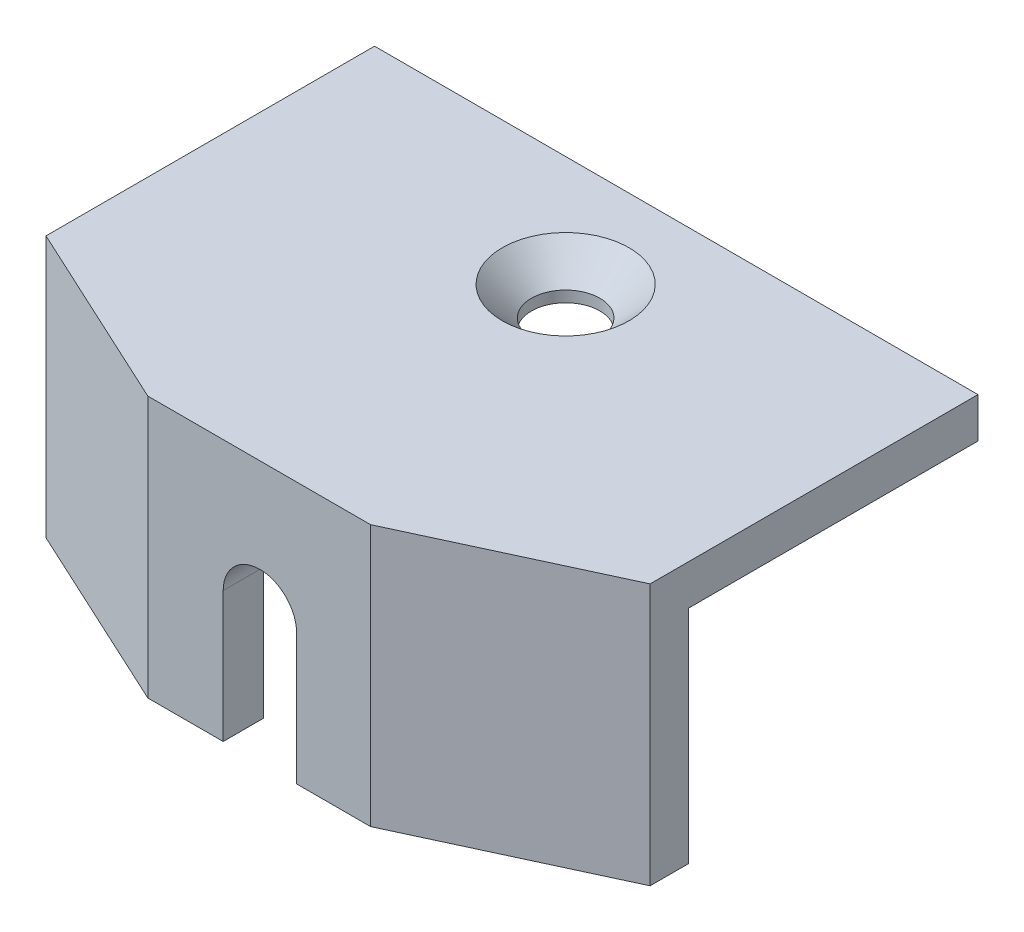
ISO-10303-21;
HEADER;
FILE_DESCRIPTION(('STEP AP214'),'2;1');
FILE_NAME('part.step','',(''),(''),'','','');
FILE_SCHEMA(('AUTOMOTIVE_DESIGN { 1 0 10303 214 1 1 1 1 }'));
ENDSEC;
DATA;
#1=APPLICATION_CONTEXT('core data for automotive mechanical design processes');
#2=APPLICATION_PROTOCOL_DEFINITION('international standard','automotive_design',2000,#1);
#3=PRODUCT_CONTEXT('',#1,'mechanical');
#4=PRODUCT('Part','Part','',(#3));
#5=PRODUCT_RELATED_PRODUCT_CATEGORY('part','',(#4));
#6=PRODUCT_DEFINITION_FORMATION('','',#4);
#7=PRODUCT_DEFINITION_CONTEXT('part definition',#1,'design');
#8=PRODUCT_DEFINITION('design','',#6,#7);
#9=PRODUCT_DEFINITION_SHAPE('','',#8);
#10=(LENGTH_UNIT() NAMED_UNIT(*) SI_UNIT(.MILLI.,.METRE.));
#11=(NAMED_UNIT(*) PLANE_ANGLE_UNIT() SI_UNIT($,.RADIAN.));
#12=(NAMED_UNIT(*) SI_UNIT($,.STERADIAN.) SOLID_ANGLE_UNIT());
#13=UNCERTAINTY_MEASURE_WITH_UNIT(LENGTH_MEASURE(1.E-05),#10,'distance_accuracy_value','');
#14=(GEOMETRIC_REPRESENTATION_CONTEXT(3) GLOBAL_UNCERTAINTY_ASSIGNED_CONTEXT((#13)) GLOBAL_UNIT_ASSIGNED_CONTEXT((#10,
#11,#12)) REPRESENTATION_CONTEXT('',''));
#15=CARTESIAN_POINT('',(0.,0.,0.));
#16=DIRECTION('',(0.,0.,1.));
#17=DIRECTION('',(1.,0.,0.));
#18=AXIS2_PLACEMENT_3D('',#15,#16,#17);
#19=CARTESIAN_POINT('',(0.,-11.,0.));
#20=DIRECTION('',(0.,1.,0.));
#21=DIRECTION('',(0.,0.,1.));
#22=AXIS2_PLACEMENT_3D('',#19,#20,#21);
#23=PLANE('',#22);
#24=DIRECTION('',(1.,0.,0.));
#25=VECTOR('',#24,1.);
#26=CARTESIAN_POINT('',(-5.57275566181239,-11.,20.700000004282));
#27=LINE('',#26,#25);
#28=CARTESIAN_POINT('',(1.825,-11.,20.700000004282));
#29=VERTEX_POINT('',#28);
#30=CARTESIAN_POINT('',(5.5,-11.,20.700000004282));
#31=VERTEX_POINT('',#30);
#32=EDGE_CURVE('E173',#29,#31,#27,.T.);
#33=ORIENTED_EDGE('',*,*,#32,.F.);
#34=DIRECTION('',(0.,0.,1.));
#35=VECTOR('',#34,1.);
#36=CARTESIAN_POINT('',(1.825,-11.,13.700000004282));
#37=LINE('',#36,#35);
#38=CARTESIAN_POINT('',(1.825,-11.,18.700000004282));
#39=VERTEX_POINT('',#38);
#40=EDGE_CURVE('E11',#29,#39,#37,.F.);
#41=ORIENTED_EDGE('',*,*,#40,.T.);
#42=DIRECTION('',(-1.,0.,0.));
#43=VECTOR('',#42,1.);
#44=CARTESIAN_POINT('',(5.71590909,-11.,18.700000004282));
#45=LINE('',#44,#43);
#46=CARTESIAN_POINT('',(5.71590909,-11.,18.700000004282));
#47=VERTEX_POINT('',#46);
#48=EDGE_CURVE('E118',#47,#39,#45,.T.);
#49=ORIENTED_EDGE('',*,*,#48,.F.);
#50=DIRECTION('',(-0.907399459721824,0.,0.420269223827466));
#51=VECTOR('',#50,1.);
#52=CARTESIAN_POINT('',(15.,-11.,14.4));
#53=LINE('',#52,#51);
#54=CARTESIAN_POINT('',(15.,-11.,14.4));
#55=VERTEX_POINT('',#54);
#56=EDGE_CURVE('E185',#55,#47,#53,.T.);
#57=ORIENTED_EDGE('',*,*,#56,.F.);
#58=DIRECTION('',(0.,0.,-1.));
#59=VECTOR('',#58,1.);
#60=CARTESIAN_POINT('',(15.,-11.,16.3000000003313));
#61=LINE('',#60,#59);
#62=CARTESIAN_POINT('',(15.,-11.,16.3000000003313));
#63=VERTEX_POINT('',#62);
#64=EDGE_CURVE('E176',#63,#55,#61,.T.);
#65=ORIENTED_EDGE('',*,*,#64,.F.);
#66=DIRECTION('',(0.907399459721825,0.,-0.420269223827466));
#67=VECTOR('',#66,1.);
#68=CARTESIAN_POINT('',(5.5,-11.,20.700000004282));
#69=LINE('',#68,#67);
#70=EDGE_CURVE('E172',#31,#63,#69,.T.);
#71=ORIENTED_EDGE('',*,*,#70,.F.);
#72=EDGE_LOOP('',(#33,#41,#49,#57,#65,#71));
#73=FACE_BOUND('',#72,.T.);
#74=ADVANCED_FACE('F41',(#73),#23,.F.);
#75=CARTESIAN_POINT('',(15.,2.,14.4));
#76=DIRECTION('',(-1.,0.,0.));
#77=DIRECTION('',(0.,0.,1.));
#78=AXIS2_PLACEMENT_3D('',#75,#76,#77);
#79=PLANE('',#78);
#80=DIRECTION('',(0.,0.,-1.));
#81=VECTOR('',#80,1.);
#82=CARTESIAN_POINT('',(15.,0.,14.4));
#83=LINE('',#82,#81);
#84=CARTESIAN_POINT('',(15.,0.,14.4));
#85=VERTEX_POINT('',#84);
#86=CARTESIAN_POINT('',(15.,0.,0.));
#87=VERTEX_POINT('',#86);
#88=EDGE_CURVE('E145',#85,#87,#83,.T.);
#89=ORIENTED_EDGE('',*,*,#88,.T.);
#90=DIRECTION('',(0.,-1.,0.));
#91=VECTOR('',#90,1.);
#92=CARTESIAN_POINT('',(15.,2.,0.));
#93=LINE('',#92,#91);
#94=CARTESIAN_POINT('',(15.,2.,0.));
#95=VERTEX_POINT('',#94);
#96=EDGE_CURVE('E149',#95,#87,#93,.T.);
#97=ORIENTED_EDGE('',*,*,#96,.F.);
#98=DIRECTION('',(0.,0.,-1.));
#99=VECTOR('',#98,1.);
#100=CARTESIAN_POINT('',(15.,2.,14.4));
#101=LINE('',#100,#99);
#102=CARTESIAN_POINT('',(15.,2.,16.3000000003313));
#103=VERTEX_POINT('',#102);
#104=EDGE_CURVE('E100',#103,#95,#101,.T.);
#105=ORIENTED_EDGE('',*,*,#104,.F.);
#106=DIRECTION('',(0.,1.,0.));
#107=VECTOR('',#106,1.);
#108=CARTESIAN_POINT('',(15.,-11.,16.3000000003313));
#109=LINE('',#108,#107);
#110=EDGE_CURVE('E205',#63,#103,#109,.T.);
#111=ORIENTED_EDGE('',*,*,#110,.F.);
#112=ORIENTED_EDGE('',*,*,#64,.T.);
#113=DIRECTION('',(0.,1.,0.));
#114=VECTOR('',#113,1.);
#115=CARTESIAN_POINT('',(15.,-11.,14.4));
#116=LINE('',#115,#114);
#117=EDGE_CURVE('E202',#55,#85,#116,.T.);
#118=ORIENTED_EDGE('',*,*,#117,.T.);
#119=EDGE_LOOP('',(#89,#97,#105,#111,#112,#118));
#120=FACE_BOUND('',#119,.T.);
#121=ADVANCED_FACE('F43',(#120),#79,.F.);
#122=CARTESIAN_POINT('',(-15.,2.,0.));
#123=DIRECTION('',(0.,0.,1.));
#124=DIRECTION('',(1.,0.,0.));
#125=AXIS2_PLACEMENT_3D('',#122,#123,#124);
#126=PLANE('',#125);
#127=DIRECTION('',(-1.,0.,0.));
#128=VECTOR('',#127,1.);
#129=CARTESIAN_POINT('',(-15.,0.,0.));
#130=LINE('',#129,#128);
#131=CARTESIAN_POINT('',(-15.,0.,0.));
#132=VERTEX_POINT('',#131);
#133=EDGE_CURVE('E101',#87,#132,#130,.T.);
#134=ORIENTED_EDGE('',*,*,#133,.T.);
#135=DIRECTION('',(0.,-1.,0.));
#136=VECTOR('',#135,1.);
#137=CARTESIAN_POINT('',(-15.,2.,0.));
#138=LINE('',#137,#136);
#139=CARTESIAN_POINT('',(-15.,2.,0.));
#140=VERTEX_POINT('',#139);
#141=EDGE_CURVE('E97',#140,#132,#138,.T.);
#142=ORIENTED_EDGE('',*,*,#141,.F.);
#143=DIRECTION('',(-1.,0.,0.));
#144=VECTOR('',#143,1.);
#145=CARTESIAN_POINT('',(-15.,2.,0.));
#146=LINE('',#145,#144);
#147=EDGE_CURVE('E65',#95,#140,#146,.T.);
#148=ORIENTED_EDGE('',*,*,#147,.F.);
#149=ORIENTED_EDGE('',*,*,#96,.T.);
#150=EDGE_LOOP('',(#134,#142,#148,#149));
#151=FACE_BOUND('',#150,.T.);
#152=ADVANCED_FACE('F296',(#151),#126,.F.);
#153=CARTESIAN_POINT('',(-15.,2.,14.4));
#154=DIRECTION('',(1.,0.,0.));
#155=DIRECTION('',(0.,0.,-1.));
#156=AXIS2_PLACEMENT_3D('',#153,#154,#155);
#157=PLANE('',#156);
#158=DIRECTION('',(0.,0.,1.));
#159=VECTOR('',#158,1.);
#160=CARTESIAN_POINT('',(-15.,0.,14.4));
#161=LINE('',#160,#159);
#162=CARTESIAN_POINT('',(-15.,0.,14.4));
#163=VERTEX_POINT('',#162);
#164=EDGE_CURVE('E88',#132,#163,#161,.T.);
#165=ORIENTED_EDGE('',*,*,#164,.T.);
#166=DIRECTION('',(0.,1.,0.));
#167=VECTOR('',#166,1.);
#168=CARTESIAN_POINT('',(-15.,-11.,14.4));
#169=LINE('',#168,#167);
#170=CARTESIAN_POINT('',(-15.,-11.,14.4));
#171=VERTEX_POINT('',#170);
#172=EDGE_CURVE('E94',#171,#163,#169,.T.);
#173=ORIENTED_EDGE('',*,*,#172,.F.);
#174=DIRECTION('',(0.,0.,1.));
#175=VECTOR('',#174,1.);
#176=CARTESIAN_POINT('',(-15.,-11.,14.4));
#177=LINE('',#176,#175);
#178=CARTESIAN_POINT('',(-15.,-11.,16.3336973595167));
#179=VERTEX_POINT('',#178);
#180=EDGE_CURVE('E224',#171,#179,#177,.T.);
#181=ORIENTED_EDGE('',*,*,#180,.T.);
#182=DIRECTION('',(0.,1.,0.));
#183=VECTOR('',#182,1.);
#184=CARTESIAN_POINT('',(-15.,-11.,16.3336973595167));
#185=LINE('',#184,#183);
#186=CARTESIAN_POINT('',(-15.,2.,16.3336973595167));
#187=VERTEX_POINT('',#186);
#188=EDGE_CURVE('E117',#179,#187,#185,.T.);
#189=ORIENTED_EDGE('',*,*,#188,.T.);
#190=DIRECTION('',(0.,0.,1.));
#191=VECTOR('',#190,1.);
#192=CARTESIAN_POINT('',(-15.,2.,14.4));
#193=LINE('',#192,#191);
#194=EDGE_CURVE('E139',#140,#187,#193,.T.);
#195=ORIENTED_EDGE('',*,*,#194,.F.);
#196=ORIENTED_EDGE('',*,*,#141,.T.);
#197=EDGE_LOOP('',(#165,#173,#181,#189,#195,#196));
#198=FACE_BOUND('',#197,.T.);
#199=ADVANCED_FACE('F90',(#198),#157,.F.);
#200=CARTESIAN_POINT('',(0.,2.,0.));
#201=DIRECTION('',(0.,1.,0.));
#202=DIRECTION('',(0.,0.,1.));
#203=AXIS2_PLACEMENT_3D('',#200,#201,#202);
#204=PLANE('',#203);
#205=CARTESIAN_POINT('',(0.,2.,5.5));
#206=DIRECTION('',(0.,1.,0.));
#207=DIRECTION('',(0.,0.,1.));
#208=AXIS2_PLACEMENT_3D('',#205,#206,#207);
#209=CIRCLE('',#208,3.15);
#210=CARTESIAN_POINT('',(0.,2.,8.65));
#211=VERTEX_POINT('',#210);
#212=EDGE_CURVE('E128',#211,#211,#209,.T.);
#213=ORIENTED_EDGE('',*,*,#212,.F.);
#214=EDGE_LOOP('',(#213));
#215=FACE_BOUND('',#214,.T.);
#216=ORIENTED_EDGE('',*,*,#194,.T.);
#217=DIRECTION('',(0.907399459721825,0.,0.420269223827466));
#218=VECTOR('',#217,1.);
#219=CARTESIAN_POINT('',(-15.,2.,16.3336973595167));
#220=LINE('',#219,#218);
#221=CARTESIAN_POINT('',(-5.57275566181239,2.,20.700000004282));
#222=VERTEX_POINT('',#221);
#223=EDGE_CURVE('E188',#187,#222,#220,.T.);
#224=ORIENTED_EDGE('',*,*,#223,.T.);
#225=DIRECTION('',(1.,0.,0.));
#226=VECTOR('',#225,1.);
#227=CARTESIAN_POINT('',(-5.57275566181239,2.,20.700000004282));
#228=LINE('',#227,#226);
#229=CARTESIAN_POINT('',(5.5,2.,20.700000004282));
#230=VERTEX_POINT('',#229);
#231=EDGE_CURVE('E191',#222,#230,#228,.T.);
#232=ORIENTED_EDGE('',*,*,#231,.T.);
#233=DIRECTION('',(0.907399459721825,0.,-0.420269223827466));
#234=VECTOR('',#233,1.);
#235=CARTESIAN_POINT('',(5.5,2.,20.700000004282));
#236=LINE('',#235,#234);
#237=EDGE_CURVE('E195',#230,#103,#236,.T.);
#238=ORIENTED_EDGE('',*,*,#237,.T.);
#239=ORIENTED_EDGE('',*,*,#104,.T.);
#240=ORIENTED_EDGE('',*,*,#147,.T.);
#241=EDGE_LOOP('',(#216,#224,#232,#238,#239,#240));
#242=FACE_BOUND('',#241,.T.);
#243=ADVANCED_FACE('F220',(#215,#242),#204,.T.);
#244=CARTESIAN_POINT('',(0.,0.,0.));
#245=DIRECTION('',(0.,1.,0.));
#246=DIRECTION('',(0.,0.,1.));
#247=AXIS2_PLACEMENT_3D('',#244,#245,#246);
#248=PLANE('',#247);
#249=CARTESIAN_POINT('',(0.,0.,5.5));
#250=DIRECTION('',(0.,1.,0.));
#251=DIRECTION('',(0.,0.,1.));
#252=AXIS2_PLACEMENT_3D('',#249,#250,#251);
#253=CIRCLE('',#252,1.7);
#254=CARTESIAN_POINT('',(0.,0.,7.2));
#255=VERTEX_POINT('',#254);
#256=EDGE_CURVE('E111',#255,#255,#253,.T.);
#257=ORIENTED_EDGE('',*,*,#256,.T.);
#258=EDGE_LOOP('',(#257));
#259=FACE_BOUND('',#258,.T.);
#260=DIRECTION('',(0.907399459721824,0.,0.420269223827466));
#261=VECTOR('',#260,1.);
#262=CARTESIAN_POINT('',(-15.,0.,14.4));
#263=LINE('',#262,#261);
#264=CARTESIAN_POINT('',(-5.71590909,0.,18.700000004282));
#265=VERTEX_POINT('',#264);
#266=EDGE_CURVE('E104',#163,#265,#263,.T.);
#267=ORIENTED_EDGE('',*,*,#266,.F.);
#268=ORIENTED_EDGE('',*,*,#164,.F.);
#269=ORIENTED_EDGE('',*,*,#133,.F.);
#270=ORIENTED_EDGE('',*,*,#88,.F.);
#271=DIRECTION('',(0.907399459721824,0.,-0.420269223827466));
#272=VECTOR('',#271,1.);
#273=CARTESIAN_POINT('',(15.,0.,14.4));
#274=LINE('',#273,#272);
#275=CARTESIAN_POINT('',(5.71590909,0.,18.700000004282));
#276=VERTEX_POINT('',#275);
#277=EDGE_CURVE('E142',#276,#85,#274,.T.);
#278=ORIENTED_EDGE('',*,*,#277,.F.);
#279=DIRECTION('',(1.,0.,0.));
#280=VECTOR('',#279,1.);
#281=CARTESIAN_POINT('',(-5.71590909,0.,18.700000004282));
#282=LINE('',#281,#280);
#283=EDGE_CURVE('E107',#265,#276,#282,.T.);
#284=ORIENTED_EDGE('',*,*,#283,.F.);
#285=EDGE_LOOP('',(#267,#268,#269,#270,#278,#284));
#286=FACE_BOUND('',#285,.T.);
#287=ADVANCED_FACE('F105',(#259,#286),#248,.F.);
#288=CARTESIAN_POINT('',(0.,2.,5.5));
#289=DIRECTION('',(0.,1.,0.));
#290=DIRECTION('',(0.,0.,1.));
#291=AXIS2_PLACEMENT_3D('',#288,#289,#290);
#292=CYLINDRICAL_SURFACE('',#291,1.69999999999999);
#293=ORIENTED_EDGE('',*,*,#256,.F.);
#294=EDGE_LOOP('',(#293));
#295=FACE_BOUND('',#294,.T.);
#296=CARTESIAN_POINT('',(0.,0.549999999999993,5.5));
#297=DIRECTION('',(0.,1.,0.));
#298=DIRECTION('',(0.,0.,1.));
#299=AXIS2_PLACEMENT_3D('',#296,#297,#298);
#300=CIRCLE('',#299,1.69999999999999);
#301=CARTESIAN_POINT('',(0.,0.549999999999993,7.19999999999999));
#302=VERTEX_POINT('',#301);
#303=EDGE_CURVE('E131',#302,#302,#300,.T.);
#304=ORIENTED_EDGE('',*,*,#303,.T.);
#305=EDGE_LOOP('',(#304));
#306=FACE_BOUND('',#305,.T.);
#307=ADVANCED_FACE('F331',(#295,#306),#292,.F.);
#308=CARTESIAN_POINT('',(0.,2.,5.5));
#309=DIRECTION('',(0.,1.,0.));
#310=DIRECTION('',(0.,0.,1.));
#311=AXIS2_PLACEMENT_3D('',#308,#309,#310);
#312=CONICAL_SURFACE('',#311,3.15,0.78539816339745);
#313=ORIENTED_EDGE('',*,*,#303,.F.);
#314=EDGE_LOOP('',(#313));
#315=FACE_BOUND('',#314,.T.);
#316=ORIENTED_EDGE('',*,*,#212,.T.);
#317=EDGE_LOOP('',(#316));
#318=FACE_BOUND('',#317,.T.);
#319=ADVANCED_FACE('F328',(#315,#318),#312,.F.);
#320=CARTESIAN_POINT('',(-5.71590909,-11.,18.700000004282));
#321=DIRECTION('',(0.420269223827466,0.,-0.907399459721825));
#322=DIRECTION('',(-0.907399459721825,0.,-0.420269223827466));
#323=AXIS2_PLACEMENT_3D('',#320,#321,#322);
#324=PLANE('',#323);
#325=ORIENTED_EDGE('',*,*,#266,.T.);
#326=DIRECTION('',(0.,1.,0.));
#327=VECTOR('',#326,1.);
#328=CARTESIAN_POINT('',(-5.71590909,-11.,18.700000004282));
#329=LINE('',#328,#327);
#330=CARTESIAN_POINT('',(-5.71590909,-11.,18.700000004282));
#331=VERTEX_POINT('',#330);
#332=EDGE_CURVE('E132',#331,#265,#329,.T.);
#333=ORIENTED_EDGE('',*,*,#332,.F.);
#334=DIRECTION('',(-0.907399459721824,0.,-0.420269223827466));
#335=VECTOR('',#334,1.);
#336=CARTESIAN_POINT('',(-5.71590909,-11.,18.700000004282));
#337=LINE('',#336,#335);
#338=EDGE_CURVE('E116',#331,#171,#337,.T.);
#339=ORIENTED_EDGE('',*,*,#338,.T.);
#340=ORIENTED_EDGE('',*,*,#172,.T.);
#341=EDGE_LOOP('',(#325,#333,#339,#340));
#342=FACE_BOUND('',#341,.T.);
#343=ADVANCED_FACE('F114',(#342),#324,.T.);
#344=CARTESIAN_POINT('',(5.71590909,-11.,18.700000004282));
#345=DIRECTION('',(0.,0.,-1.));
#346=DIRECTION('',(-1.,0.,0.));
#347=AXIS2_PLACEMENT_3D('',#344,#345,#346);
#348=PLANE('',#347);
#349=DIRECTION('',(0.,-1.,0.));
#350=VECTOR('',#349,1.);
#351=CARTESIAN_POINT('',(1.825,-11.,18.700000004282));
#352=LINE('',#351,#350);
#353=CARTESIAN_POINT('',(1.825,-4.5,18.700000004282));
#354=VERTEX_POINT('',#353);
#355=EDGE_CURVE('E230',#354,#39,#352,.T.);
#356=ORIENTED_EDGE('',*,*,#355,.F.);
#357=CARTESIAN_POINT('',(0.,-4.5,18.700000004282));
#358=DIRECTION('',(0.,0.,-1.));
#359=DIRECTION('',(-1.,0.,0.));
#360=AXIS2_PLACEMENT_3D('',#357,#358,#359);
#361=CIRCLE('',#360,1.825);
#362=CARTESIAN_POINT('',(-1.825,-4.5,18.700000004282));
#363=VERTEX_POINT('',#362);
#364=EDGE_CURVE('E192',#363,#354,#361,.T.);
#365=ORIENTED_EDGE('',*,*,#364,.F.);
#366=DIRECTION('',(0.,1.,0.));
#367=VECTOR('',#366,1.);
#368=CARTESIAN_POINT('',(-1.825,-11.,18.700000004282));
#369=LINE('',#368,#367);
#370=CARTESIAN_POINT('',(-1.825,-11.,18.700000004282));
#371=VERTEX_POINT('',#370);
#372=EDGE_CURVE('E233',#371,#363,#369,.T.);
#373=ORIENTED_EDGE('',*,*,#372,.F.);
#374=EDGE_CURVE('E124',#371,#331,#45,.T.);
#375=ORIENTED_EDGE('',*,*,#374,.T.);
#376=ORIENTED_EDGE('',*,*,#332,.T.);
#377=ORIENTED_EDGE('',*,*,#283,.T.);
#378=DIRECTION('',(0.,1.,0.));
#379=VECTOR('',#378,1.);
#380=CARTESIAN_POINT('',(5.71590909,-11.,18.700000004282));
#381=LINE('',#380,#379);
#382=EDGE_CURVE('E199',#47,#276,#381,.T.);
#383=ORIENTED_EDGE('',*,*,#382,.F.);
#384=ORIENTED_EDGE('',*,*,#48,.T.);
#385=EDGE_LOOP('',(#356,#365,#373,#375,#376,#377,#383,#384));
#386=FACE_BOUND('',#385,.T.);
#387=ADVANCED_FACE('F327',(#386),#348,.T.);
#388=CARTESIAN_POINT('',(15.,-11.,14.4));
#389=DIRECTION('',(-0.420269223827466,0.,-0.907399459721825));
#390=DIRECTION('',(-0.907399459721825,0.,0.420269223827466));
#391=AXIS2_PLACEMENT_3D('',#388,#389,#390);
#392=PLANE('',#391);
#393=ORIENTED_EDGE('',*,*,#277,.T.);
#394=ORIENTED_EDGE('',*,*,#117,.F.);
#395=ORIENTED_EDGE('',*,*,#56,.T.);
#396=ORIENTED_EDGE('',*,*,#382,.T.);
#397=EDGE_LOOP('',(#393,#394,#395,#396));
#398=FACE_BOUND('',#397,.T.);
#399=ADVANCED_FACE('F287',(#398),#392,.T.);
#400=CARTESIAN_POINT('',(5.5,-11.,20.700000004282));
#401=DIRECTION('',(0.420269223827466,0.,0.907399459721825));
#402=DIRECTION('',(0.907399459721825,0.,-0.420269223827466));
#403=AXIS2_PLACEMENT_3D('',#400,#401,#402);
#404=PLANE('',#403);
#405=ORIENTED_EDGE('',*,*,#237,.F.);
#406=DIRECTION('',(0.,1.,0.));
#407=VECTOR('',#406,1.);
#408=CARTESIAN_POINT('',(5.5,-11.,20.700000004282));
#409=LINE('',#408,#407);
#410=EDGE_CURVE('E208',#31,#230,#409,.T.);
#411=ORIENTED_EDGE('',*,*,#410,.F.);
#412=ORIENTED_EDGE('',*,*,#70,.T.);
#413=ORIENTED_EDGE('',*,*,#110,.T.);
#414=EDGE_LOOP('',(#405,#411,#412,#413));
#415=FACE_BOUND('',#414,.T.);
#416=ADVANCED_FACE('F294',(#415),#404,.T.);
#417=CARTESIAN_POINT('',(-5.57275566181239,-11.,20.700000004282));
#418=DIRECTION('',(0.,0.,1.));
#419=DIRECTION('',(1.,0.,0.));
#420=AXIS2_PLACEMENT_3D('',#417,#418,#419);
#421=PLANE('',#420);
#422=DIRECTION('',(0.,1.,0.));
#423=VECTOR('',#422,1.);
#424=CARTESIAN_POINT('',(1.825,-4.5,20.700000004282));
#425=LINE('',#424,#423);
#426=CARTESIAN_POINT('',(1.825,-4.5,20.700000004282));
#427=VERTEX_POINT('',#426);
#428=EDGE_CURVE('E238',#29,#427,#425,.T.);
#429=ORIENTED_EDGE('',*,*,#428,.F.);
#430=ORIENTED_EDGE('',*,*,#32,.T.);
#431=ORIENTED_EDGE('',*,*,#410,.T.);
#432=ORIENTED_EDGE('',*,*,#231,.F.);
#433=DIRECTION('',(0.,1.,0.));
#434=VECTOR('',#433,1.);
#435=CARTESIAN_POINT('',(-5.57275566181239,-11.,20.700000004282));
#436=LINE('',#435,#434);
#437=CARTESIAN_POINT('',(-5.57275566181239,-11.,20.700000004282));
#438=VERTEX_POINT('',#437);
#439=EDGE_CURVE('E121',#438,#222,#436,.T.);
#440=ORIENTED_EDGE('',*,*,#439,.F.);
#441=CARTESIAN_POINT('',(-1.825,-11.,20.700000004282));
#442=VERTEX_POINT('',#441);
#443=EDGE_CURVE('E158',#438,#442,#27,.T.);
#444=ORIENTED_EDGE('',*,*,#443,.T.);
#445=DIRECTION('',(0.,-1.,0.));
#446=VECTOR('',#445,1.);
#447=CARTESIAN_POINT('',(-1.825,-4.5,20.700000004282));
#448=LINE('',#447,#446);
#449=CARTESIAN_POINT('',(-1.825,-4.5,20.700000004282));
#450=VERTEX_POINT('',#449);
#451=EDGE_CURVE('E56',#450,#442,#448,.T.);
#452=ORIENTED_EDGE('',*,*,#451,.F.);
#453=CARTESIAN_POINT('',(0.,-4.5,20.700000004282));
#454=DIRECTION('',(0.,0.,1.));
#455=DIRECTION('',(1.,0.,0.));
#456=AXIS2_PLACEMENT_3D('',#453,#454,#455);
#457=CIRCLE('',#456,1.825);
#458=EDGE_CURVE('E244',#427,#450,#457,.T.);
#459=ORIENTED_EDGE('',*,*,#458,.F.);
#460=EDGE_LOOP('',(#429,#430,#431,#432,#440,#444,#452,#459));
#461=FACE_BOUND('',#460,.T.);
#462=ADVANCED_FACE('F167',(#461),#421,.T.);
#463=CARTESIAN_POINT('',(-15.,-11.,16.3336973595167));
#464=DIRECTION('',(-0.420269223827466,0.,0.907399459721825));
#465=DIRECTION('',(0.907399459721825,0.,0.420269223827466));
#466=AXIS2_PLACEMENT_3D('',#463,#464,#465);
#467=PLANE('',#466);
#468=ORIENTED_EDGE('',*,*,#223,.F.);
#469=ORIENTED_EDGE('',*,*,#188,.F.);
#470=DIRECTION('',(0.907399459721825,0.,0.420269223827466));
#471=VECTOR('',#470,1.);
#472=CARTESIAN_POINT('',(-15.,-11.,16.3336973595167));
#473=LINE('',#472,#471);
#474=EDGE_CURVE('E179',#179,#438,#473,.T.);
#475=ORIENTED_EDGE('',*,*,#474,.T.);
#476=ORIENTED_EDGE('',*,*,#439,.T.);
#477=EDGE_LOOP('',(#468,#469,#475,#476));
#478=FACE_BOUND('',#477,.T.);
#479=ADVANCED_FACE('F213',(#478),#467,.T.);
#480=ORIENTED_EDGE('',*,*,#374,.F.);
#481=DIRECTION('',(0.,0.,1.));
#482=VECTOR('',#481,1.);
#483=CARTESIAN_POINT('',(-1.825,-11.,0.));
#484=LINE('',#483,#482);
#485=EDGE_CURVE('E49',#371,#442,#484,.T.);
#486=ORIENTED_EDGE('',*,*,#485,.T.);
#487=ORIENTED_EDGE('',*,*,#443,.F.);
#488=ORIENTED_EDGE('',*,*,#474,.F.);
#489=ORIENTED_EDGE('',*,*,#180,.F.);
#490=ORIENTED_EDGE('',*,*,#338,.F.);
#491=EDGE_LOOP('',(#480,#486,#487,#488,#489,#490));
#492=FACE_BOUND('',#491,.T.);
#493=ADVANCED_FACE('F155',(#492),#23,.F.);
#494=CARTESIAN_POINT('',(0.,-4.5,13.700000004282));
#495=DIRECTION('',(0.,0.,1.));
#496=DIRECTION('',(1.,0.,0.));
#497=AXIS2_PLACEMENT_3D('',#494,#495,#496);
#498=CYLINDRICAL_SURFACE('',#497,1.825);
#499=ORIENTED_EDGE('',*,*,#364,.T.);
#500=DIRECTION('',(0.,0.,1.));
#501=VECTOR('',#500,1.);
#502=CARTESIAN_POINT('',(1.825,-4.5,13.700000004282));
#503=LINE('',#502,#501);
#504=EDGE_CURVE('E235',#354,#427,#503,.T.);
#505=ORIENTED_EDGE('',*,*,#504,.T.);
#506=ORIENTED_EDGE('',*,*,#458,.T.);
#507=DIRECTION('',(0.,0.,1.));
#508=VECTOR('',#507,1.);
#509=CARTESIAN_POINT('',(-1.825,-4.5,13.700000004282));
#510=LINE('',#509,#508);
#511=EDGE_CURVE('E236',#363,#450,#510,.T.);
#512=ORIENTED_EDGE('',*,*,#511,.F.);
#513=EDGE_LOOP('',(#499,#505,#506,#512));
#514=FACE_BOUND('',#513,.T.);
#515=ADVANCED_FACE('F248',(#514),#498,.F.);
#516=CARTESIAN_POINT('',(1.825,-4.5,13.700000004282));
#517=DIRECTION('',(1.,0.,0.));
#518=DIRECTION('',(0.,1.,0.));
#519=AXIS2_PLACEMENT_3D('',#516,#517,#518);
#520=PLANE('',#519);
#521=ORIENTED_EDGE('',*,*,#355,.T.);
#522=ORIENTED_EDGE('',*,*,#40,.F.);
#523=ORIENTED_EDGE('',*,*,#428,.T.);
#524=ORIENTED_EDGE('',*,*,#504,.F.);
#525=EDGE_LOOP('',(#521,#522,#523,#524));
#526=FACE_BOUND('',#525,.T.);
#527=ADVANCED_FACE('F317',(#526),#520,.F.);
#528=CARTESIAN_POINT('',(-1.825,-4.5,13.700000004282));
#529=DIRECTION('',(-1.,0.,0.));
#530=DIRECTION('',(0.,-1.,0.));
#531=AXIS2_PLACEMENT_3D('',#528,#529,#530);
#532=PLANE('',#531);
#533=ORIENTED_EDGE('',*,*,#372,.T.);
#534=ORIENTED_EDGE('',*,*,#511,.T.);
#535=ORIENTED_EDGE('',*,*,#451,.T.);
#536=ORIENTED_EDGE('',*,*,#485,.F.);
#537=EDGE_LOOP('',(#533,#534,#535,#536));
#538=FACE_BOUND('',#537,.T.);
#539=ADVANCED_FACE('F403',(#538),#532,.F.);
#540=CLOSED_SHELL('',(#74,#121,#152,#199,#243,#287,#307,#319,#343,#387,#399,#416,#462,#479,#493,
#515,#527,#539));
#541=MANIFOLD_SOLID_BREP('B2',#540);
#542=ADVANCED_BREP_SHAPE_REPRESENTATION('',(#18,#541),#14);
#543=SHAPE_DEFINITION_REPRESENTATION(#9,#542);
ENDSEC;
END-ISO-10303-21;
